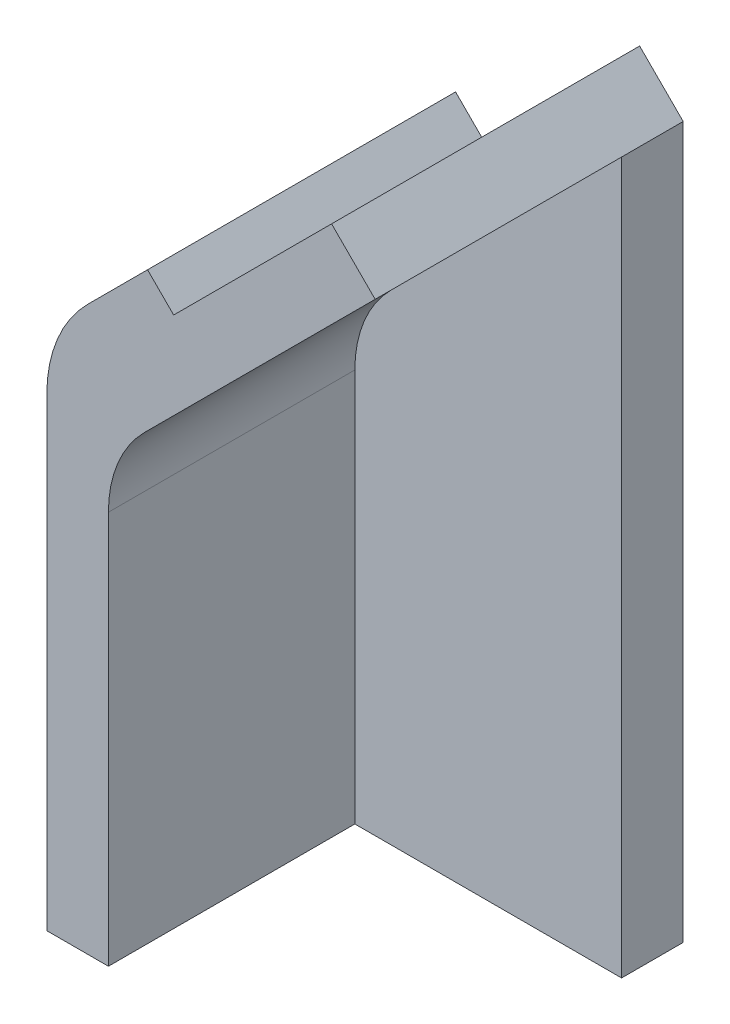
ISO-10303-21;
HEADER;
FILE_DESCRIPTION(('STEP AP214'),'2;1');
FILE_NAME('part.step','',(''),(''),'','','');
FILE_SCHEMA(('AUTOMOTIVE_DESIGN { 1 0 10303 214 1 1 1 1 }'));
ENDSEC;
DATA;
#1=APPLICATION_CONTEXT('core data for automotive mechanical design processes');
#2=APPLICATION_PROTOCOL_DEFINITION('international standard','automotive_design',2000,#1);
#3=PRODUCT_CONTEXT('',#1,'mechanical');
#4=PRODUCT('Part','Part','',(#3));
#5=PRODUCT_RELATED_PRODUCT_CATEGORY('part','',(#4));
#6=PRODUCT_DEFINITION_FORMATION('','',#4);
#7=PRODUCT_DEFINITION_CONTEXT('part definition',#1,'design');
#8=PRODUCT_DEFINITION('design','',#6,#7);
#9=PRODUCT_DEFINITION_SHAPE('','',#8);
#10=(LENGTH_UNIT() NAMED_UNIT(*) SI_UNIT(.MILLI.,.METRE.));
#11=(NAMED_UNIT(*) PLANE_ANGLE_UNIT() SI_UNIT($,.RADIAN.));
#12=(NAMED_UNIT(*) SI_UNIT($,.STERADIAN.) SOLID_ANGLE_UNIT());
#13=UNCERTAINTY_MEASURE_WITH_UNIT(LENGTH_MEASURE(1.E-05),#10,'distance_accuracy_value','');
#14=(GEOMETRIC_REPRESENTATION_CONTEXT(3) GLOBAL_UNCERTAINTY_ASSIGNED_CONTEXT((#13)) GLOBAL_UNIT_ASSIGNED_CONTEXT((#10,
#11,#12)) REPRESENTATION_CONTEXT('',''));
#15=CARTESIAN_POINT('',(0.,0.,0.));
#16=DIRECTION('',(0.,0.,1.));
#17=DIRECTION('',(1.,0.,0.));
#18=AXIS2_PLACEMENT_3D('',#15,#16,#17);
#19=CARTESIAN_POINT('',(-39.12,14.3749879036647,-23.895));
#20=DIRECTION('',(0.,0.,-1.));
#21=DIRECTION('',(-1.,0.,0.));
#22=AXIS2_PLACEMENT_3D('',#19,#20,#21);
#23=CYLINDRICAL_SURFACE('',#22,4.);
#24=CARTESIAN_POINT('',(-39.12,14.3749879036647,-31.895));
#25=DIRECTION('',(0.,0.,-1.));
#26=DIRECTION('',(-1.,0.,0.));
#27=AXIS2_PLACEMENT_3D('',#24,#25,#26);
#28=CIRCLE('',#27,4.);
#29=CARTESIAN_POINT('',(-43.12,14.3749879036648,-31.895));
#30=VERTEX_POINT('',#29);
#31=CARTESIAN_POINT('',(-41.9484271247462,17.2034150284109,-31.895));
#32=VERTEX_POINT('',#31);
#33=EDGE_CURVE('E47',#30,#32,#28,.T.);
#34=ORIENTED_EDGE('',*,*,#33,.T.);
#35=DIRECTION('',(0.,0.,-1.));
#36=VECTOR('',#35,1.);
#37=CARTESIAN_POINT('',(-41.9484271247462,17.2034150284109,-23.895));
#38=LINE('',#37,#36);
#39=CARTESIAN_POINT('',(-41.9484271247462,17.2034150284109,-23.895));
#40=VERTEX_POINT('',#39);
#41=EDGE_CURVE('E11',#40,#32,#38,.T.);
#42=ORIENTED_EDGE('',*,*,#41,.F.);
#43=CARTESIAN_POINT('',(-39.12,14.3749879036647,-23.895));
#44=DIRECTION('',(0.,0.,-1.));
#45=DIRECTION('',(1.,0.,0.));
#46=AXIS2_PLACEMENT_3D('',#43,#44,#45);
#47=CIRCLE('',#46,4.);
#48=CARTESIAN_POINT('',(-43.12,14.3749879036648,-23.895));
#49=VERTEX_POINT('',#48);
#50=EDGE_CURVE('E152',#49,#40,#47,.T.);
#51=ORIENTED_EDGE('',*,*,#50,.F.);
#52=DIRECTION('',(0.,0.,-1.));
#53=VECTOR('',#52,1.);
#54=CARTESIAN_POINT('',(-43.12,14.3749879036648,-23.895));
#55=LINE('',#54,#53);
#56=EDGE_CURVE('E173',#49,#30,#55,.T.);
#57=ORIENTED_EDGE('',*,*,#56,.T.);
#58=EDGE_LOOP('',(#34,#42,#51,#57));
#59=FACE_BOUND('',#58,.T.);
#60=ADVANCED_FACE('F33',(#59),#23,.F.);
#61=CARTESIAN_POINT('',(-34.4608486732067,24.6909934799505,-23.895));
#62=DIRECTION('',(-0.707106781186551,0.707106781186544,0.));
#63=DIRECTION('',(-0.707106781186544,-0.707106781186551,0.));
#64=AXIS2_PLACEMENT_3D('',#61,#62,#63);
#65=PLANE('',#64);
#66=DIRECTION('',(0.707106781186544,0.707106781186551,0.));
#67=VECTOR('',#66,1.);
#68=CARTESIAN_POINT('',(-41.9484271247462,17.2034150284109,-31.895));
#69=LINE('',#68,#67);
#70=CARTESIAN_POINT('',(-34.4608486732067,24.6909934799505,-31.895));
#71=VERTEX_POINT('',#70);
#72=EDGE_CURVE('E53',#32,#71,#69,.T.);
#73=ORIENTED_EDGE('',*,*,#72,.T.);
#74=DIRECTION('',(0.,0.,-1.));
#75=VECTOR('',#74,1.);
#76=CARTESIAN_POINT('',(-34.4608486732067,24.6909934799505,-23.895));
#77=LINE('',#76,#75);
#78=CARTESIAN_POINT('',(-34.4608486732067,24.6909934799505,-23.895));
#79=VERTEX_POINT('',#78);
#80=EDGE_CURVE('E40',#79,#71,#77,.T.);
#81=ORIENTED_EDGE('',*,*,#80,.F.);
#82=DIRECTION('',(0.707106781186544,0.707106781186551,0.));
#83=VECTOR('',#82,1.);
#84=CARTESIAN_POINT('',(-34.4608486732067,24.6909934799505,-23.895));
#85=LINE('',#84,#83);
#86=EDGE_CURVE('E155',#40,#79,#85,.T.);
#87=ORIENTED_EDGE('',*,*,#86,.F.);
#88=ORIENTED_EDGE('',*,*,#41,.T.);
#89=EDGE_LOOP('',(#73,#81,#87,#88));
#90=FACE_BOUND('',#89,.T.);
#91=ADVANCED_FACE('F210',(#90),#65,.F.);
#92=CARTESIAN_POINT('',(-43.12,14.3749879036648,-23.895));
#93=DIRECTION('',(-1.,0.,0.));
#94=DIRECTION('',(0.,-1.,0.));
#95=AXIS2_PLACEMENT_3D('',#92,#93,#94);
#96=PLANE('',#95);
#97=DIRECTION('',(0.,1.,0.));
#98=VECTOR('',#97,1.);
#99=CARTESIAN_POINT('',(-43.12,1.60999999999999,-31.895));
#100=LINE('',#99,#98);
#101=CARTESIAN_POINT('',(-43.12,1.60999999999999,-31.895));
#102=VERTEX_POINT('',#101);
#103=EDGE_CURVE('E140',#102,#30,#100,.T.);
#104=ORIENTED_EDGE('',*,*,#103,.T.);
#105=ORIENTED_EDGE('',*,*,#56,.F.);
#106=DIRECTION('',(0.,1.,0.));
#107=VECTOR('',#106,1.);
#108=CARTESIAN_POINT('',(-43.12,14.3749879036648,-23.895));
#109=LINE('',#108,#107);
#110=CARTESIAN_POINT('',(-43.12,1.60999999999999,-23.895));
#111=VERTEX_POINT('',#110);
#112=EDGE_CURVE('E171',#111,#49,#109,.T.);
#113=ORIENTED_EDGE('',*,*,#112,.F.);
#114=DIRECTION('',(0.,0.,-1.));
#115=VECTOR('',#114,1.);
#116=CARTESIAN_POINT('',(-43.12,1.60999999999999,-23.895));
#117=LINE('',#116,#115);
#118=EDGE_CURVE('E187',#111,#102,#117,.T.);
#119=ORIENTED_EDGE('',*,*,#118,.T.);
#120=EDGE_LOOP('',(#104,#105,#113,#119));
#121=FACE_BOUND('',#120,.T.);
#122=ADVANCED_FACE('F220',(#121),#96,.F.);
#123=CARTESIAN_POINT('',(-35.8750622355798,26.1052070423236,-23.895));
#124=DIRECTION('',(-0.707106781186546,-0.707106781186549,0.));
#125=DIRECTION('',(0.707106781186549,-0.707106781186546,0.));
#126=AXIS2_PLACEMENT_3D('',#123,#124,#125);
#127=PLANE('',#126);
#128=DIRECTION('',(-0.707106781186549,0.707106781186546,0.));
#129=VECTOR('',#128,1.);
#130=CARTESIAN_POINT('',(-35.8750622355798,26.1052070423236,-33.895));
#131=LINE('',#130,#129);
#132=CARTESIAN_POINT('',(-34.4608486732067,24.6909934799505,-33.895));
#133=VERTEX_POINT('',#132);
#134=CARTESIAN_POINT('',(-35.8750622355798,26.1052070423236,-33.895));
#135=VERTEX_POINT('',#134);
#136=EDGE_CURVE('E132',#133,#135,#131,.T.);
#137=ORIENTED_EDGE('',*,*,#136,.T.);
#138=DIRECTION('',(0.,0.,-1.));
#139=VECTOR('',#138,1.);
#140=CARTESIAN_POINT('',(-35.8750622355798,26.1052070423236,-23.895));
#141=LINE('',#140,#139);
#142=CARTESIAN_POINT('',(-35.8750622355798,26.1052070423236,-23.895));
#143=VERTEX_POINT('',#142);
#144=EDGE_CURVE('E203',#143,#135,#141,.T.);
#145=ORIENTED_EDGE('',*,*,#144,.F.);
#146=DIRECTION('',(-0.707106781186549,0.707106781186546,0.));
#147=VECTOR('',#146,1.);
#148=CARTESIAN_POINT('',(-35.8750622355798,26.1052070423236,-23.895));
#149=LINE('',#148,#147);
#150=EDGE_CURVE('E157',#79,#143,#149,.T.);
#151=ORIENTED_EDGE('',*,*,#150,.F.);
#152=ORIENTED_EDGE('',*,*,#80,.T.);
#153=DIRECTION('',(0.,0.,-1.));
#154=VECTOR('',#153,1.);
#155=CARTESIAN_POINT('',(-34.4608486732067,24.6909934799505,-31.895));
#156=LINE('',#155,#154);
#157=EDGE_CURVE('E133',#71,#133,#156,.T.);
#158=ORIENTED_EDGE('',*,*,#157,.T.);
#159=EDGE_LOOP('',(#137,#145,#151,#152,#158));
#160=FACE_BOUND('',#159,.T.);
#161=ADVANCED_FACE('F207',(#160),#127,.F.);
#162=CARTESIAN_POINT('',(-41.0015863991823,20.9786828787211,-23.895));
#163=DIRECTION('',(0.707106781186551,-0.707106781186544,0.));
#164=DIRECTION('',(0.707106781186544,0.707106781186551,0.));
#165=AXIS2_PLACEMENT_3D('',#162,#163,#164);
#166=PLANE('',#165);
#167=DIRECTION('',(-0.707106781186544,-0.707106781186551,0.));
#168=VECTOR('',#167,1.);
#169=CARTESIAN_POINT('',(-41.0015863991823,20.9786828787211,-33.895));
#170=LINE('',#169,#168);
#171=CARTESIAN_POINT('',(-41.0015863991823,20.9786828787211,-33.895));
#172=VERTEX_POINT('',#171);
#173=EDGE_CURVE('E175',#135,#172,#170,.T.);
#174=ORIENTED_EDGE('',*,*,#173,.T.);
#175=DIRECTION('',(0.,0.,-1.));
#176=VECTOR('',#175,1.);
#177=CARTESIAN_POINT('',(-41.0015863991823,20.9786828787211,-23.895));
#178=LINE('',#177,#176);
#179=CARTESIAN_POINT('',(-41.0015863991823,20.9786828787211,-23.895));
#180=VERTEX_POINT('',#179);
#181=EDGE_CURVE('E200',#180,#172,#178,.T.);
#182=ORIENTED_EDGE('',*,*,#181,.F.);
#183=DIRECTION('',(-0.707106781186544,-0.707106781186551,0.));
#184=VECTOR('',#183,1.);
#185=CARTESIAN_POINT('',(-41.0015863991823,20.9786828787211,-23.895));
#186=LINE('',#185,#184);
#187=EDGE_CURVE('E159',#143,#180,#186,.T.);
#188=ORIENTED_EDGE('',*,*,#187,.F.);
#189=ORIENTED_EDGE('',*,*,#144,.T.);
#190=EDGE_LOOP('',(#174,#182,#188,#189));
#191=FACE_BOUND('',#190,.T.);
#192=ADVANCED_FACE('F229',(#191),#166,.F.);
#193=CARTESIAN_POINT('',(-41.8501145366061,21.8272110161449,-23.895));
#194=DIRECTION('',(-0.70710678118654,-0.707106781186555,0.));
#195=DIRECTION('',(0.707106781186555,-0.70710678118654,0.));
#196=AXIS2_PLACEMENT_3D('',#193,#194,#195);
#197=PLANE('',#196);
#198=DIRECTION('',(-0.707106781186555,0.70710678118654,0.));
#199=VECTOR('',#198,1.);
#200=CARTESIAN_POINT('',(-41.8501145366061,21.8272110161449,-33.895));
#201=LINE('',#200,#199);
#202=CARTESIAN_POINT('',(-41.8501145366061,21.8272110161449,-33.895));
#203=VERTEX_POINT('',#202);
#204=EDGE_CURVE('E177',#172,#203,#201,.T.);
#205=ORIENTED_EDGE('',*,*,#204,.T.);
#206=DIRECTION('',(0.,0.,-1.));
#207=VECTOR('',#206,1.);
#208=CARTESIAN_POINT('',(-41.8501145366061,21.8272110161449,-23.895));
#209=LINE('',#208,#207);
#210=CARTESIAN_POINT('',(-41.8501145366061,21.8272110161449,-23.895));
#211=VERTEX_POINT('',#210);
#212=EDGE_CURVE('E197',#211,#203,#209,.T.);
#213=ORIENTED_EDGE('',*,*,#212,.F.);
#214=DIRECTION('',(-0.707106781186555,0.70710678118654,0.));
#215=VECTOR('',#214,1.);
#216=CARTESIAN_POINT('',(-41.8501145366061,21.8272110161449,-23.895));
#217=LINE('',#216,#215);
#218=EDGE_CURVE('E161',#180,#211,#217,.T.);
#219=ORIENTED_EDGE('',*,*,#218,.F.);
#220=ORIENTED_EDGE('',*,*,#181,.T.);
#221=EDGE_LOOP('',(#205,#213,#219,#220));
#222=FACE_BOUND('',#221,.T.);
#223=ADVANCED_FACE('F232',(#222),#197,.F.);
#224=CARTESIAN_POINT('',(-43.7946581848691,19.8826673678819,-23.895));
#225=DIRECTION('',(0.707106781186551,-0.707106781186544,0.));
#226=DIRECTION('',(0.707106781186544,0.707106781186551,0.));
#227=AXIS2_PLACEMENT_3D('',#224,#225,#226);
#228=PLANE('',#227);
#229=DIRECTION('',(-0.707106781186544,-0.707106781186551,0.));
#230=VECTOR('',#229,1.);
#231=CARTESIAN_POINT('',(-43.7946581848691,19.8826673678819,-33.895));
#232=LINE('',#231,#230);
#233=CARTESIAN_POINT('',(-43.7946581848691,19.8826673678819,-33.895));
#234=VERTEX_POINT('',#233);
#235=EDGE_CURVE('E179',#203,#234,#232,.T.);
#236=ORIENTED_EDGE('',*,*,#235,.T.);
#237=DIRECTION('',(0.,0.,-1.));
#238=VECTOR('',#237,1.);
#239=CARTESIAN_POINT('',(-43.7946581848691,19.8826673678819,-23.895));
#240=LINE('',#239,#238);
#241=CARTESIAN_POINT('',(-43.7946581848691,19.8826673678819,-23.895));
#242=VERTEX_POINT('',#241);
#243=EDGE_CURVE('E194',#242,#234,#240,.T.);
#244=ORIENTED_EDGE('',*,*,#243,.F.);
#245=DIRECTION('',(-0.707106781186544,-0.707106781186551,0.));
#246=VECTOR('',#245,1.);
#247=CARTESIAN_POINT('',(-43.7946581848691,19.8826673678819,-23.895));
#248=LINE('',#247,#246);
#249=EDGE_CURVE('E163',#211,#242,#248,.T.);
#250=ORIENTED_EDGE('',*,*,#249,.F.);
#251=ORIENTED_EDGE('',*,*,#212,.T.);
#252=EDGE_LOOP('',(#236,#244,#250,#251));
#253=FACE_BOUND('',#252,.T.);
#254=ADVANCED_FACE('F236',(#253),#228,.F.);
#255=CARTESIAN_POINT('',(-40.595,16.6830091830128,-23.895));
#256=DIRECTION('',(0.,0.,-1.));
#257=DIRECTION('',(-1.,0.,0.));
#258=AXIS2_PLACEMENT_3D('',#255,#256,#257);
#259=CYLINDRICAL_SURFACE('',#258,4.525);
#260=CARTESIAN_POINT('',(-40.595,16.6830091830128,-33.895));
#261=DIRECTION('',(0.,0.,1.));
#262=DIRECTION('',(1.,0.,0.));
#263=AXIS2_PLACEMENT_3D('',#260,#261,#262);
#264=CIRCLE('',#263,4.525);
#265=CARTESIAN_POINT('',(-45.12,16.6830091830128,-33.895));
#266=VERTEX_POINT('',#265);
#267=EDGE_CURVE('E181',#234,#266,#264,.T.);
#268=ORIENTED_EDGE('',*,*,#267,.T.);
#269=DIRECTION('',(0.,0.,-1.));
#270=VECTOR('',#269,1.);
#271=CARTESIAN_POINT('',(-45.12,16.6830091830128,-23.895));
#272=LINE('',#271,#270);
#273=CARTESIAN_POINT('',(-45.12,16.6830091830128,-23.895));
#274=VERTEX_POINT('',#273);
#275=EDGE_CURVE('E191',#274,#266,#272,.T.);
#276=ORIENTED_EDGE('',*,*,#275,.F.);
#277=CARTESIAN_POINT('',(-40.595,16.6830091830128,-23.895));
#278=DIRECTION('',(0.,0.,1.));
#279=DIRECTION('',(1.,0.,0.));
#280=AXIS2_PLACEMENT_3D('',#277,#278,#279);
#281=CIRCLE('',#280,4.525);
#282=EDGE_CURVE('E165',#242,#274,#281,.T.);
#283=ORIENTED_EDGE('',*,*,#282,.F.);
#284=ORIENTED_EDGE('',*,*,#243,.T.);
#285=EDGE_LOOP('',(#268,#276,#283,#284));
#286=FACE_BOUND('',#285,.T.);
#287=ADVANCED_FACE('F240',(#286),#259,.T.);
#288=CARTESIAN_POINT('',(-45.12,1.60999999999999,-23.895));
#289=DIRECTION('',(1.,0.,0.));
#290=DIRECTION('',(0.,1.,0.));
#291=AXIS2_PLACEMENT_3D('',#288,#289,#290);
#292=PLANE('',#291);
#293=DIRECTION('',(0.,-1.,0.));
#294=VECTOR('',#293,1.);
#295=CARTESIAN_POINT('',(-45.12,1.60999999999999,-33.895));
#296=LINE('',#295,#294);
#297=CARTESIAN_POINT('',(-45.12,1.60999999999999,-33.895));
#298=VERTEX_POINT('',#297);
#299=EDGE_CURVE('E183',#266,#298,#296,.T.);
#300=ORIENTED_EDGE('',*,*,#299,.T.);
#301=DIRECTION('',(0.,0.,-1.));
#302=VECTOR('',#301,1.);
#303=CARTESIAN_POINT('',(-45.12,1.60999999999999,-23.895));
#304=LINE('',#303,#302);
#305=CARTESIAN_POINT('',(-45.12,1.60999999999999,-23.895));
#306=VERTEX_POINT('',#305);
#307=EDGE_CURVE('E189',#306,#298,#304,.T.);
#308=ORIENTED_EDGE('',*,*,#307,.F.);
#309=DIRECTION('',(0.,-1.,0.));
#310=VECTOR('',#309,1.);
#311=CARTESIAN_POINT('',(-45.12,1.60999999999999,-23.895));
#312=LINE('',#311,#310);
#313=EDGE_CURVE('E167',#274,#306,#312,.T.);
#314=ORIENTED_EDGE('',*,*,#313,.F.);
#315=ORIENTED_EDGE('',*,*,#275,.T.);
#316=EDGE_LOOP('',(#300,#308,#314,#315));
#317=FACE_BOUND('',#316,.T.);
#318=ADVANCED_FACE('F244',(#317),#292,.F.);
#319=CARTESIAN_POINT('',(-43.12,1.60999999999999,-23.895));
#320=DIRECTION('',(0.,1.,0.));
#321=DIRECTION('',(0.,0.,1.));
#322=AXIS2_PLACEMENT_3D('',#319,#320,#321);
#323=PLANE('',#322);
#324=DIRECTION('',(1.,0.,0.));
#325=VECTOR('',#324,1.);
#326=CARTESIAN_POINT('',(-43.12,1.60999999999999,-33.895));
#327=LINE('',#326,#325);
#328=CARTESIAN_POINT('',(-34.4608486732067,1.60999999999999,-33.895));
#329=VERTEX_POINT('',#328);
#330=EDGE_CURVE('E127',#298,#329,#327,.T.);
#331=ORIENTED_EDGE('',*,*,#330,.T.);
#332=DIRECTION('',(0.,0.,-1.));
#333=VECTOR('',#332,1.);
#334=CARTESIAN_POINT('',(-34.4608486732067,1.60999999999999,-31.895));
#335=LINE('',#334,#333);
#336=CARTESIAN_POINT('',(-34.4608486732067,1.60999999999999,-31.895));
#337=VERTEX_POINT('',#336);
#338=EDGE_CURVE('E120',#337,#329,#335,.T.);
#339=ORIENTED_EDGE('',*,*,#338,.F.);
#340=DIRECTION('',(-1.,0.,0.));
#341=VECTOR('',#340,1.);
#342=CARTESIAN_POINT('',(-34.4608486732067,1.60999999999999,-31.895));
#343=LINE('',#342,#341);
#344=EDGE_CURVE('E124',#337,#102,#343,.T.);
#345=ORIENTED_EDGE('',*,*,#344,.T.);
#346=ORIENTED_EDGE('',*,*,#118,.F.);
#347=DIRECTION('',(1.,0.,0.));
#348=VECTOR('',#347,1.);
#349=CARTESIAN_POINT('',(-43.12,1.60999999999999,-23.895));
#350=LINE('',#349,#348);
#351=EDGE_CURVE('E169',#306,#111,#350,.T.);
#352=ORIENTED_EDGE('',*,*,#351,.F.);
#353=ORIENTED_EDGE('',*,*,#307,.T.);
#354=EDGE_LOOP('',(#331,#339,#345,#346,#352,#353));
#355=FACE_BOUND('',#354,.T.);
#356=ADVANCED_FACE('F122',(#355),#323,.F.);
#357=CARTESIAN_POINT('',(-39.12,14.3749879036647,-23.895));
#358=DIRECTION('',(0.,0.,1.));
#359=DIRECTION('',(1.,0.,0.));
#360=AXIS2_PLACEMENT_3D('',#357,#358,#359);
#361=PLANE('',#360);
#362=ORIENTED_EDGE('',*,*,#50,.T.);
#363=ORIENTED_EDGE('',*,*,#86,.T.);
#364=ORIENTED_EDGE('',*,*,#150,.T.);
#365=ORIENTED_EDGE('',*,*,#187,.T.);
#366=ORIENTED_EDGE('',*,*,#218,.T.);
#367=ORIENTED_EDGE('',*,*,#249,.T.);
#368=ORIENTED_EDGE('',*,*,#282,.T.);
#369=ORIENTED_EDGE('',*,*,#313,.T.);
#370=ORIENTED_EDGE('',*,*,#351,.T.);
#371=ORIENTED_EDGE('',*,*,#112,.T.);
#372=EDGE_LOOP('',(#362,#363,#364,#365,#366,#367,#368,#369,#370,#371));
#373=FACE_BOUND('',#372,.T.);
#374=ADVANCED_FACE('F213',(#373),#361,.T.);
#375=CARTESIAN_POINT('',(-39.12,14.3749879036647,-33.895));
#376=DIRECTION('',(0.,0.,1.));
#377=DIRECTION('',(1.,0.,0.));
#378=AXIS2_PLACEMENT_3D('',#375,#376,#377);
#379=PLANE('',#378);
#380=ORIENTED_EDGE('',*,*,#136,.F.);
#381=DIRECTION('',(0.,-1.,0.));
#382=VECTOR('',#381,1.);
#383=CARTESIAN_POINT('',(-34.4608486732067,24.6909934799505,-33.895));
#384=LINE('',#383,#382);
#385=EDGE_CURVE('E145',#133,#329,#384,.T.);
#386=ORIENTED_EDGE('',*,*,#385,.T.);
#387=ORIENTED_EDGE('',*,*,#330,.F.);
#388=ORIENTED_EDGE('',*,*,#299,.F.);
#389=ORIENTED_EDGE('',*,*,#267,.F.);
#390=ORIENTED_EDGE('',*,*,#235,.F.);
#391=ORIENTED_EDGE('',*,*,#204,.F.);
#392=ORIENTED_EDGE('',*,*,#173,.F.);
#393=EDGE_LOOP('',(#380,#386,#387,#388,#389,#390,#391,#392));
#394=FACE_BOUND('',#393,.T.);
#395=ADVANCED_FACE('F251',(#394),#379,.F.);
#396=CARTESIAN_POINT('',(-34.4608486732067,24.6909934799505,-31.895));
#397=DIRECTION('',(1.,0.,0.));
#398=DIRECTION('',(0.,0.,-1.));
#399=AXIS2_PLACEMENT_3D('',#396,#397,#398);
#400=PLANE('',#399);
#401=ORIENTED_EDGE('',*,*,#385,.F.);
#402=ORIENTED_EDGE('',*,*,#157,.F.);
#403=DIRECTION('',(0.,-1.,0.));
#404=VECTOR('',#403,1.);
#405=CARTESIAN_POINT('',(-34.4608486732067,24.6909934799505,-31.895));
#406=LINE('',#405,#404);
#407=EDGE_CURVE('E139',#71,#337,#406,.T.);
#408=ORIENTED_EDGE('',*,*,#407,.T.);
#409=ORIENTED_EDGE('',*,*,#338,.T.);
#410=EDGE_LOOP('',(#401,#402,#408,#409));
#411=FACE_BOUND('',#410,.T.);
#412=ADVANCED_FACE('F143',(#411),#400,.T.);
#413=CARTESIAN_POINT('',(-39.12,14.3749879036647,-31.895));
#414=DIRECTION('',(0.,0.,-1.));
#415=DIRECTION('',(-1.,0.,0.));
#416=AXIS2_PLACEMENT_3D('',#413,#414,#415);
#417=PLANE('',#416);
#418=ORIENTED_EDGE('',*,*,#72,.F.);
#419=ORIENTED_EDGE('',*,*,#33,.F.);
#420=ORIENTED_EDGE('',*,*,#103,.F.);
#421=ORIENTED_EDGE('',*,*,#344,.F.);
#422=ORIENTED_EDGE('',*,*,#407,.F.);
#423=EDGE_LOOP('',(#418,#419,#420,#421,#422));
#424=FACE_BOUND('',#423,.T.);
#425=ADVANCED_FACE('F138',(#424),#417,.F.);
#426=CLOSED_SHELL('',(#60,#91,#122,#161,#192,#223,#254,#287,#318,#356,#374,#395,#412,#425));
#427=MANIFOLD_SOLID_BREP('B2',#426);
#428=ADVANCED_BREP_SHAPE_REPRESENTATION('',(#18,#427),#14);
#429=SHAPE_DEFINITION_REPRESENTATION(#9,#428);
ENDSEC;
END-ISO-10303-21;
